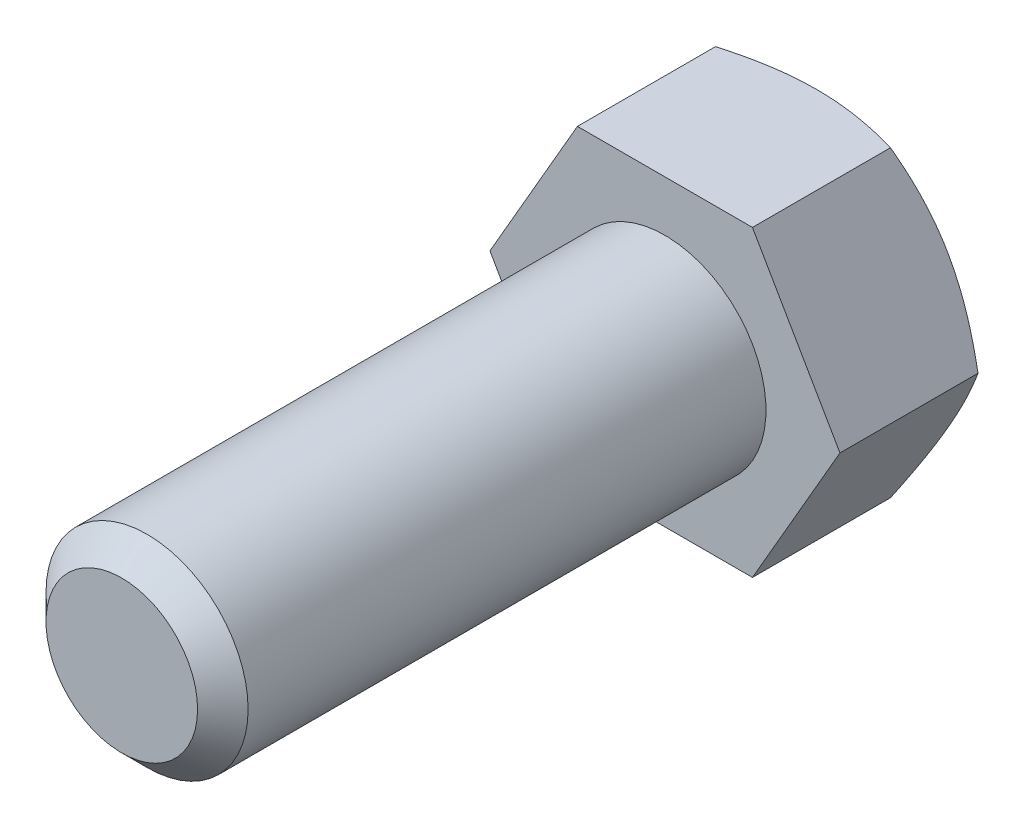
ISO-10303-21;
HEADER;
FILE_DESCRIPTION(('STEP AP214'),'2;1');
FILE_NAME('part.step','',(''),(''),'','','');
FILE_SCHEMA(('AUTOMOTIVE_DESIGN { 1 0 10303 214 1 1 1 1 }'));
ENDSEC;
DATA;
#1=APPLICATION_CONTEXT('core data for automotive mechanical design processes');
#2=APPLICATION_PROTOCOL_DEFINITION('international standard','automotive_design',2000,#1);
#3=PRODUCT_CONTEXT('',#1,'mechanical');
#4=PRODUCT('Part','Part','',(#3));
#5=PRODUCT_RELATED_PRODUCT_CATEGORY('part','',(#4));
#6=PRODUCT_DEFINITION_FORMATION('','',#4);
#7=PRODUCT_DEFINITION_CONTEXT('part definition',#1,'design');
#8=PRODUCT_DEFINITION('design','',#6,#7);
#9=PRODUCT_DEFINITION_SHAPE('','',#8);
#10=(LENGTH_UNIT() NAMED_UNIT(*) SI_UNIT(.MILLI.,.METRE.));
#11=(NAMED_UNIT(*) PLANE_ANGLE_UNIT() SI_UNIT($,.RADIAN.));
#12=(NAMED_UNIT(*) SI_UNIT($,.STERADIAN.) SOLID_ANGLE_UNIT());
#13=UNCERTAINTY_MEASURE_WITH_UNIT(LENGTH_MEASURE(1.E-05),#10,'distance_accuracy_value','');
#14=(GEOMETRIC_REPRESENTATION_CONTEXT(3) GLOBAL_UNCERTAINTY_ASSIGNED_CONTEXT((#13)) GLOBAL_UNIT_ASSIGNED_CONTEXT((#10,
#11,#12)) REPRESENTATION_CONTEXT('',''));
#15=CARTESIAN_POINT('',(0.,0.,0.));
#16=DIRECTION('',(0.,0.,1.));
#17=DIRECTION('',(1.,0.,0.));
#18=AXIS2_PLACEMENT_3D('',#15,#16,#17);
#19=CARTESIAN_POINT('',(0.,0.,21.5));
#20=DIRECTION('',(0.,0.,-1.));
#21=DIRECTION('',(-1.,0.,0.));
#22=AXIS2_PLACEMENT_3D('',#19,#20,#21);
#23=CYLINDRICAL_SURFACE('',#22,4.);
#24=CARTESIAN_POINT('',(0.,0.,20.5));
#25=DIRECTION('',(0.,0.,1.));
#26=DIRECTION('',(1.,0.,0.));
#27=AXIS2_PLACEMENT_3D('',#24,#25,#26);
#28=CIRCLE('',#27,4.);
#29=CARTESIAN_POINT('',(4.,0.,20.5));
#30=VERTEX_POINT('',#29);
#31=EDGE_CURVE('E11',#30,#30,#28,.F.);
#32=ORIENTED_EDGE('',*,*,#31,.T.);
#33=EDGE_LOOP('',(#32));
#34=FACE_BOUND('',#33,.T.);
#35=CARTESIAN_POINT('',(0.,0.,0.));
#36=DIRECTION('',(0.,0.,-1.));
#37=DIRECTION('',(-1.,0.,0.));
#38=AXIS2_PLACEMENT_3D('',#35,#36,#37);
#39=CIRCLE('',#38,4.);
#40=CARTESIAN_POINT('',(-4.,0.,0.));
#41=VERTEX_POINT('',#40);
#42=EDGE_CURVE('E143',#41,#41,#39,.T.);
#43=ORIENTED_EDGE('',*,*,#42,.F.);
#44=EDGE_LOOP('',(#43));
#45=FACE_BOUND('',#44,.T.);
#46=ADVANCED_FACE('F32',(#34,#45),#23,.T.);
#47=CARTESIAN_POINT('',(0.,0.,21.5));
#48=DIRECTION('',(0.,0.,1.));
#49=DIRECTION('',(1.,0.,0.));
#50=AXIS2_PLACEMENT_3D('',#47,#48,#49);
#51=PLANE('',#50);
#52=CARTESIAN_POINT('',(0.,0.,21.5));
#53=DIRECTION('',(0.,0.,1.));
#54=DIRECTION('',(1.,0.,0.));
#55=AXIS2_PLACEMENT_3D('',#52,#53,#54);
#56=CIRCLE('',#55,3.00000000000001);
#57=CARTESIAN_POINT('',(3.00000000000001,0.,21.5));
#58=VERTEX_POINT('',#57);
#59=EDGE_CURVE('E40',#58,#58,#56,.T.);
#60=ORIENTED_EDGE('',*,*,#59,.T.);
#61=EDGE_LOOP('',(#60));
#62=FACE_BOUND('',#61,.T.);
#63=ADVANCED_FACE('F235',(#62),#51,.T.);
#64=CARTESIAN_POINT('',(-3.46410161513776,-6.,0.));
#65=DIRECTION('',(0.,0.,-1.));
#66=DIRECTION('',(-1.,0.,0.));
#67=AXIS2_PLACEMENT_3D('',#64,#65,#66);
#68=PLANE('',#67);
#69=DIRECTION('',(-1.,0.,0.));
#70=VECTOR('',#69,1.);
#71=CARTESIAN_POINT('',(3.46410161513775,-6.,0.));
#72=LINE('',#71,#70);
#73=CARTESIAN_POINT('',(3.46410161513775,-6.,0.));
#74=VERTEX_POINT('',#73);
#75=CARTESIAN_POINT('',(-3.46410161513776,-6.,0.));
#76=VERTEX_POINT('',#75);
#77=EDGE_CURVE('E179',#74,#76,#72,.T.);
#78=ORIENTED_EDGE('',*,*,#77,.F.);
#79=DIRECTION('',(-0.5,-0.866025403784438,0.));
#80=VECTOR('',#79,1.);
#81=CARTESIAN_POINT('',(6.9282032302755,0.,0.));
#82=LINE('',#81,#80);
#83=CARTESIAN_POINT('',(6.9282032302755,0.,0.));
#84=VERTEX_POINT('',#83);
#85=EDGE_CURVE('E267',#84,#74,#82,.T.);
#86=ORIENTED_EDGE('',*,*,#85,.F.);
#87=DIRECTION('',(0.5,-0.866025403784439,0.));
#88=VECTOR('',#87,1.);
#89=CARTESIAN_POINT('',(3.46410161513775,6.,0.));
#90=LINE('',#89,#88);
#91=CARTESIAN_POINT('',(3.46410161513775,6.,0.));
#92=VERTEX_POINT('',#91);
#93=EDGE_CURVE('E265',#92,#84,#90,.T.);
#94=ORIENTED_EDGE('',*,*,#93,.F.);
#95=DIRECTION('',(1.,0.,0.));
#96=VECTOR('',#95,1.);
#97=CARTESIAN_POINT('',(-3.46410161513775,6.,0.));
#98=LINE('',#97,#96);
#99=CARTESIAN_POINT('',(-3.46410161513775,6.,0.));
#100=VERTEX_POINT('',#99);
#101=EDGE_CURVE('E129',#100,#92,#98,.T.);
#102=ORIENTED_EDGE('',*,*,#101,.F.);
#103=DIRECTION('',(0.5,0.866025403784439,0.));
#104=VECTOR('',#103,1.);
#105=CARTESIAN_POINT('',(-6.92820323027551,0.,0.));
#106=LINE('',#105,#104);
#107=CARTESIAN_POINT('',(-6.92820323027551,0.,0.));
#108=VERTEX_POINT('',#107);
#109=EDGE_CURVE('E262',#108,#100,#106,.T.);
#110=ORIENTED_EDGE('',*,*,#109,.F.);
#111=DIRECTION('',(-0.5,0.866025403784439,0.));
#112=VECTOR('',#111,1.);
#113=CARTESIAN_POINT('',(-3.46410161513776,-6.,0.));
#114=LINE('',#113,#112);
#115=EDGE_CURVE('E181',#76,#108,#114,.T.);
#116=ORIENTED_EDGE('',*,*,#115,.F.);
#117=EDGE_LOOP('',(#78,#86,#94,#102,#110,#116));
#118=FACE_BOUND('',#117,.T.);
#119=ORIENTED_EDGE('',*,*,#42,.T.);
#120=EDGE_LOOP('',(#119));
#121=FACE_BOUND('',#120,.T.);
#122=ADVANCED_FACE('F232',(#118,#121),#68,.F.);
#123=CARTESIAN_POINT('',(3.46410161513775,-6.,-6.));
#124=DIRECTION('',(0.,1.,0.));
#125=DIRECTION('',(-1.,0.,0.));
#126=AXIS2_PLACEMENT_3D('',#123,#124,#125);
#127=PLANE('',#126);
#128=DIRECTION('',(0.,0.,1.));
#129=VECTOR('',#128,1.);
#130=CARTESIAN_POINT('',(-3.46410161513776,-6.,-6.));
#131=LINE('',#130,#129);
#132=CARTESIAN_POINT('',(-3.46410161513776,-5.99999999999999,-5.46410161513775));
#133=VERTEX_POINT('',#132);
#134=EDGE_CURVE('E141',#133,#76,#131,.T.);
#135=ORIENTED_EDGE('',*,*,#134,.F.);
#136=CARTESIAN_POINT('',(-9.18730798493837,-6.,-3.12883976813902));
#137=CARTESIAN_POINT('',(-8.92387405680199,-6.,-3.25614559419349));
#138=CARTESIAN_POINT('',(-8.65981728204025,-6.,-3.38218589446083));
#139=CARTESIAN_POINT('',(-8.13012127105821,-6.,-3.63101227963227));
#140=CARTESIAN_POINT('',(-7.86448177047662,-6.,-3.75379780110516));
#141=CARTESIAN_POINT('',(-7.32984857652428,-6.,-3.9960383057581));
#142=CARTESIAN_POINT('',(-7.06084438765349,-6.,-4.11547020861922));
#143=CARTESIAN_POINT('',(-6.52062501689612,-6.,-4.34920412065581));
#144=CARTESIAN_POINT('',(-6.24940995113133,-6.,-4.46350639722907));
#145=CARTESIAN_POINT('',(-5.70097061739307,-6.,-4.6869740289727));
#146=CARTESIAN_POINT('',(-5.42371345319408,-6.,-4.79605909080157));
#147=CARTESIAN_POINT('',(-4.86592864106517,-6.,-5.00568563643364));
#148=CARTESIAN_POINT('',(-4.58540063320821,-6.,-5.10622616970276));
#149=CARTESIAN_POINT('',(-4.02120500054274,-6.,-5.2960624411625));
#150=CARTESIAN_POINT('',(-3.73754550105854,-6.,-5.38538208572986));
#151=CARTESIAN_POINT('',(-3.16619097443998,-6.,-5.54987472735296));
#152=CARTESIAN_POINT('',(-2.87849725452286,-6.,-5.62505219808297));
#153=CARTESIAN_POINT('',(-2.29889164457506,-6.,-5.75761469520685));
#154=CARTESIAN_POINT('',(-2.0069786530133,-6.,-5.81499498413221));
#155=CARTESIAN_POINT('',(-1.41959231625986,-6.,-5.90808533304653));
#156=CARTESIAN_POINT('',(-1.12411896792062,-6.,-5.94379537387626));
#157=CARTESIAN_POINT('',(-0.680438735196221,-6.,-5.97881855810124));
#158=CARTESIAN_POINT('',(-0.53292635721201,-6.,-5.98740441714177));
#159=CARTESIAN_POINT('',(-0.237663606264503,-6.,-5.99832545726344));
#160=CARTESIAN_POINT('',(-0.0899132364168048,-6.,-6.00066071951749));
#161=CARTESIAN_POINT('',(0.205509638911241,-6.,-5.99901783541769));
#162=CARTESIAN_POINT('',(0.353182154606617,-6.,-5.9950414609043));
#163=CARTESIAN_POINT('',(0.648231355348831,-6.,-5.98087607767417));
#164=CARTESIAN_POINT('',(0.795608025253494,-6.,-5.97068675870647));
#165=CARTESIAN_POINT('',(1.15280356987546,-6.,-5.93867365999944));
#166=CARTESIAN_POINT('',(1.36234795134398,-6.,-5.91373672745244));
#167=CARTESIAN_POINT('',(1.77983105181144,-6.,-5.85268625722611));
#168=CARTESIAN_POINT('',(1.98776931664951,-6.,-5.81656966890792));
#169=CARTESIAN_POINT('',(2.4018685647083,-6.,-5.73444076581617));
#170=CARTESIAN_POINT('',(2.60802767447155,-6.,-5.68841909457091));
#171=CARTESIAN_POINT('',(3.01822481374517,-6.,-5.58788421774175));
#172=CARTESIAN_POINT('',(3.22226304114188,-6.,-5.53337181210118));
#173=CARTESIAN_POINT('',(3.63324382691672,-6.,-5.41573466169866));
#174=CARTESIAN_POINT('',(3.84013498116184,-6.,-5.35243156345535));
#175=CARTESIAN_POINT('',(4.25173044522394,-6.,-5.2195706551928));
#176=CARTESIAN_POINT('',(4.45643615593418,-6.,-5.15001715929896));
#177=CARTESIAN_POINT('',(4.86283932319813,-6.,-5.00609215113832));
#178=CARTESIAN_POINT('',(5.06454722675188,-6.,-4.93174996149461));
#179=CARTESIAN_POINT('',(5.46639806025811,-6.,-4.77870211902801));
#180=CARTESIAN_POINT('',(5.66654031987448,-6.,-4.69999470264218));
#181=CARTESIAN_POINT('',(5.86595548480023,-6.,-4.61953649018731));
#182=B_SPLINE_CURVE_WITH_KNOTS('',3,(#136,#137,#138,#139,#140,#141,#142,#143,#144,#145,#146,
#147,#148,#149,#150,#151,#152,#153,#154,#155,#156,#157,#158,#159,#160,#161,#162,#163,#164,#165,
#166,#167,#168,#169,#170,#171,#172,#173,#174,#175,#176,#177,#178,#179,#180,#181),.UNSPECIFIED.,
.F.,.F.,(4,2,2,2,2,2,2,2,2,2,2,2,2,2,2,2,2,2,2,2,2,2,4),(0.,0.877757688798423,1.7556663458989,
2.63859891968983,3.52148541427241,4.4152110149623,5.30903590816034,6.20092297046388,
7.09252742087207,7.98436900601768,8.8762113796622,9.31938497202548,9.76255280911933,
10.2055962594862,10.6486618355806,11.2813783152956,11.9142675993976,12.5477573636587,
13.1811874805773,13.8301443386227,14.4786566669059,15.1235187321248,15.7686432484322),.UNSPECIFIED.);
#183=CARTESIAN_POINT('',(0.,-6.,-6.));
#184=VERTEX_POINT('',#183);
#185=EDGE_CURVE('E125',#133,#184,#182,.T.);
#186=ORIENTED_EDGE('',*,*,#185,.T.);
#187=CARTESIAN_POINT('',(3.46410161513775,-6.,-5.46410161513775));
#188=VERTEX_POINT('',#187);
#189=EDGE_CURVE('E47',#184,#188,#182,.T.);
#190=ORIENTED_EDGE('',*,*,#189,.T.);
#191=DIRECTION('',(0.,0.,1.));
#192=VECTOR('',#191,1.);
#193=CARTESIAN_POINT('',(3.46410161513775,-6.,-6.));
#194=LINE('',#193,#192);
#195=EDGE_CURVE('E136',#188,#74,#194,.T.);
#196=ORIENTED_EDGE('',*,*,#195,.T.);
#197=ORIENTED_EDGE('',*,*,#77,.T.);
#198=EDGE_LOOP('',(#135,#186,#190,#196,#197));
#199=FACE_BOUND('',#198,.T.);
#200=ADVANCED_FACE('F234',(#199),#127,.F.);
#201=CARTESIAN_POINT('',(-3.46410161513776,-6.,-6.));
#202=DIRECTION('',(0.866025403784439,0.5,0.));
#203=DIRECTION('',(-0.5,0.866025403784439,0.));
#204=AXIS2_PLACEMENT_3D('',#201,#202,#203);
#205=PLANE('',#204);
#206=DIRECTION('',(0.,0.,1.));
#207=VECTOR('',#206,1.);
#208=CARTESIAN_POINT('',(-6.92820323027551,0.,-6.));
#209=LINE('',#208,#207);
#210=CARTESIAN_POINT('',(-6.9282032302755,0.,-5.46410161513775));
#211=VERTEX_POINT('',#210);
#212=EDGE_CURVE('E134',#211,#108,#209,.T.);
#213=ORIENTED_EDGE('',*,*,#212,.F.);
#214=CARTESIAN_POINT('',(-6.92831870032935,0.000199999999999566,-5.46403494680444));
#215=CARTESIAN_POINT('',(-6.85217369681759,-0.131687014824876,-5.50799100088407));
#216=CARTESIAN_POINT('',(-6.7757447877387,-0.264065768516575,-5.5499521927796));
#217=CARTESIAN_POINT('',(-6.62226628317934,-0.529898336283082,-5.62933542320521));
#218=CARTESIAN_POINT('',(-6.54521643511296,-0.663352587849513,-5.66675550360435));
#219=CARTESIAN_POINT('',(-6.31283321525997,-1.06585213146133,-5.77146958991382));
#220=CARTESIAN_POINT('',(-6.15658254390818,-1.33648623295938,-5.83102994261809));
#221=CARTESIAN_POINT('',(-5.92275625451824,-1.74148524632807,-5.90087178928477));
#222=CARTESIAN_POINT('',(-5.84587929350304,-1.87464004873788,-5.92076777194817));
#223=CARTESIAN_POINT('',(-5.69177799808121,-2.14155132192067,-5.95413058520104));
#224=CARTESIAN_POINT('',(-5.6145536949758,-2.27530773847835,-5.96759798384113));
#225=CARTESIAN_POINT('',(-5.45997096038123,-2.54305288876908,-5.98776040824964));
#226=CARTESIAN_POINT('',(-5.38261278137646,-2.67704118518633,-5.99446312000014));
#227=CARTESIAN_POINT('',(-5.22782922676437,-2.94513416595059,-6.00095963658988));
#228=CARTESIAN_POINT('',(-5.1504038533067,-3.07923884657428,-6.00075365485193));
#229=CARTESIAN_POINT('',(-4.93828180440546,-3.44664501267684,-5.99069281477429));
#230=CARTESIAN_POINT('',(-4.8036545605159,-3.67982623917651,-5.97380210699772));
#231=CARTESIAN_POINT('',(-4.53529425885134,-4.14463991639405,-5.92024077720943));
#232=CARTESIAN_POINT('',(-4.40156214490546,-4.3762707323519,-5.88355184703624));
#233=CARTESIAN_POINT('',(-4.13266173796312,-4.84201989935198,-5.7918398733043));
#234=CARTESIAN_POINT('',(-3.99752737632065,-5.07607947956512,-5.73642824328934));
#235=CARTESIAN_POINT('',(-3.7292739250165,-5.54070808652961,-5.61066608681661));
#236=CARTESIAN_POINT('',(-3.59615139973116,-5.77128306395569,-5.54034510268382));
#237=CARTESIAN_POINT('',(-3.46398614508392,-6.0002,-5.46403494680444));
#238=B_SPLINE_CURVE_WITH_KNOTS('',3,(#214,#215,#216,#217,#218,#219,#220,#221,#222,#223,#224,
#225,#226,#227,#228,#229,#230,#231,#232,#233,#234,#235,#236,#237),.UNSPECIFIED.,.F.,.F.,(4,2,2,
2,2,2,2,2,2,2,2,4),(0.,0.475482194578527,0.95116869439248,1.90451835622162,2.36951738073403,
2.83447530880777,3.29890435872168,3.76331906154279,4.57182194271095,5.38107376137308,
6.20827406017204,7.03385036012984),.UNSPECIFIED.);
#239=CARTESIAN_POINT('',(-5.19615242270663,-3.,-6.));
#240=VERTEX_POINT('',#239);
#241=EDGE_CURVE('E171',#211,#240,#238,.T.);
#242=ORIENTED_EDGE('',*,*,#241,.T.);
#243=EDGE_CURVE('E114',#240,#133,#238,.T.);
#244=ORIENTED_EDGE('',*,*,#243,.T.);
#245=ORIENTED_EDGE('',*,*,#134,.T.);
#246=ORIENTED_EDGE('',*,*,#115,.T.);
#247=EDGE_LOOP('',(#213,#242,#244,#245,#246));
#248=FACE_BOUND('',#247,.T.);
#249=ADVANCED_FACE('F241',(#248),#205,.F.);
#250=CARTESIAN_POINT('',(-6.92820323027551,0.,-6.));
#251=DIRECTION('',(0.866025403784438,-0.5,0.));
#252=DIRECTION('',(0.5,0.866025403784439,0.));
#253=AXIS2_PLACEMENT_3D('',#250,#251,#252);
#254=PLANE('',#253);
#255=DIRECTION('',(0.,0.,1.));
#256=VECTOR('',#255,1.);
#257=CARTESIAN_POINT('',(-3.46410161513775,6.,-6.));
#258=LINE('',#257,#256);
#259=CARTESIAN_POINT('',(-3.46410161513775,6.,-5.46410161513775));
#260=VERTEX_POINT('',#259);
#261=EDGE_CURVE('E131',#260,#100,#258,.T.);
#262=ORIENTED_EDGE('',*,*,#261,.F.);
#263=CARTESIAN_POINT('',(-3.46398614508392,6.0002,-5.46403494680445));
#264=CARTESIAN_POINT('',(-3.54013114859567,5.86831298517512,-5.50799100088407));
#265=CARTESIAN_POINT('',(-3.61656005767456,5.73593423148342,-5.5499521927796));
#266=CARTESIAN_POINT('',(-3.77003856223393,5.47010166371692,-5.62933542320521));
#267=CARTESIAN_POINT('',(-3.8470884103003,5.33664741215048,-5.66675550360435));
#268=CARTESIAN_POINT('',(-4.07947163015329,4.93414786853867,-5.77146958991382));
#269=CARTESIAN_POINT('',(-4.23572230150508,4.66351376704062,-5.8310299426181));
#270=CARTESIAN_POINT('',(-4.46954859089502,4.25851475367193,-5.90087178928477));
#271=CARTESIAN_POINT('',(-4.54642555191022,4.12535995126212,-5.92076777194817));
#272=CARTESIAN_POINT('',(-4.70052684733205,3.85844867807933,-5.95413058520104));
#273=CARTESIAN_POINT('',(-4.77775115043746,3.72469226152165,-5.96759798384113));
#274=CARTESIAN_POINT('',(-4.93233388503204,3.45694711123092,-5.98776040824964));
#275=CARTESIAN_POINT('',(-5.0096920640368,3.32295881481367,-5.99446312000014));
#276=CARTESIAN_POINT('',(-5.16447561864889,3.05486583404941,-6.00095963658988));
#277=CARTESIAN_POINT('',(-5.24190099210656,2.92076115342572,-6.00075365485193));
#278=CARTESIAN_POINT('',(-5.45402304100781,2.55335498732316,-5.99069281477429));
#279=CARTESIAN_POINT('',(-5.58865028489736,2.32017376082349,-5.97380210699772));
#280=CARTESIAN_POINT('',(-5.85701058656193,1.85536008360595,-5.92024077720943));
#281=CARTESIAN_POINT('',(-5.99074270050781,1.62372926764809,-5.88355184703624));
#282=CARTESIAN_POINT('',(-6.25964310745014,1.15798010064802,-5.7918398733043));
#283=CARTESIAN_POINT('',(-6.39477746909261,0.923920520434875,-5.73642824328934));
#284=CARTESIAN_POINT('',(-6.66303092039676,0.459291913470389,-5.61066608681661));
#285=CARTESIAN_POINT('',(-6.7961534456821,0.228716936044308,-5.54034510268382));
#286=CARTESIAN_POINT('',(-6.92831870032935,-0.000200000000000896,-5.46403494680444));
#287=B_SPLINE_CURVE_WITH_KNOTS('',3,(#263,#264,#265,#266,#267,#268,#269,#270,#271,#272,#273,
#274,#275,#276,#277,#278,#279,#280,#281,#282,#283,#284,#285,#286),.UNSPECIFIED.,.F.,.F.,(4,2,2,
2,2,2,2,2,2,2,2,4),(0.,0.475482194578527,0.951168694392479,1.90451835622162,2.36951738073403,
2.83447530880777,3.29890435872168,3.76331906154279,4.57182194271094,5.38107376137308,
6.20827406017204,7.03385036012984),.UNSPECIFIED.);
#288=CARTESIAN_POINT('',(-5.19615242270663,3.,-6.));
#289=VERTEX_POINT('',#288);
#290=EDGE_CURVE('E163',#260,#289,#287,.T.);
#291=ORIENTED_EDGE('',*,*,#290,.T.);
#292=EDGE_CURVE('E168',#289,#211,#287,.T.);
#293=ORIENTED_EDGE('',*,*,#292,.T.);
#294=ORIENTED_EDGE('',*,*,#212,.T.);
#295=ORIENTED_EDGE('',*,*,#109,.T.);
#296=EDGE_LOOP('',(#262,#291,#293,#294,#295));
#297=FACE_BOUND('',#296,.T.);
#298=ADVANCED_FACE('F177',(#297),#254,.F.);
#299=CARTESIAN_POINT('',(-3.46410161513775,6.,-6.));
#300=DIRECTION('',(0.,-1.,0.));
#301=DIRECTION('',(0.,0.,-1.));
#302=AXIS2_PLACEMENT_3D('',#299,#300,#301);
#303=PLANE('',#302);
#304=DIRECTION('',(0.,0.,1.));
#305=VECTOR('',#304,1.);
#306=CARTESIAN_POINT('',(3.46410161513775,6.,-6.));
#307=LINE('',#306,#305);
#308=CARTESIAN_POINT('',(3.46410161513775,6.,-5.46410161513775));
#309=VERTEX_POINT('',#308);
#310=EDGE_CURVE('E122',#309,#92,#307,.T.);
#311=ORIENTED_EDGE('',*,*,#310,.F.);
#312=CARTESIAN_POINT('',(-9.18730798493837,6.,-3.12883976813902));
#313=CARTESIAN_POINT('',(-8.92387405680198,6.,-3.2561455941935));
#314=CARTESIAN_POINT('',(-8.65981728204025,6.,-3.38218589446084));
#315=CARTESIAN_POINT('',(-8.13012127105821,6.,-3.63101227963227));
#316=CARTESIAN_POINT('',(-7.86448177047662,6.,-3.75379780110517));
#317=CARTESIAN_POINT('',(-7.32984857652428,6.,-3.9960383057581));
#318=CARTESIAN_POINT('',(-7.06084438765349,6.,-4.11547020861922));
#319=CARTESIAN_POINT('',(-6.52062501689612,6.,-4.34920412065581));
#320=CARTESIAN_POINT('',(-6.24940995113133,6.,-4.46350639722907));
#321=CARTESIAN_POINT('',(-5.70097061739307,6.,-4.6869740289727));
#322=CARTESIAN_POINT('',(-5.42371345319408,6.,-4.79605909080157));
#323=CARTESIAN_POINT('',(-4.86592864106517,6.,-5.00568563643364));
#324=CARTESIAN_POINT('',(-4.58540063320821,6.,-5.10622616970276));
#325=CARTESIAN_POINT('',(-4.02120500054274,6.,-5.2960624411625));
#326=CARTESIAN_POINT('',(-3.73754550105854,6.,-5.38538208572986));
#327=CARTESIAN_POINT('',(-3.16619097443998,6.,-5.54987472735296));
#328=CARTESIAN_POINT('',(-2.87849725452286,6.,-5.62505219808297));
#329=CARTESIAN_POINT('',(-2.29889164457506,6.,-5.75761469520685));
#330=CARTESIAN_POINT('',(-2.0069786530133,6.,-5.81499498413222));
#331=CARTESIAN_POINT('',(-1.41959231625986,6.,-5.90808533304653));
#332=CARTESIAN_POINT('',(-1.12411896792062,6.,-5.94379537387627));
#333=CARTESIAN_POINT('',(-0.680438735196222,6.,-5.97881855810124));
#334=CARTESIAN_POINT('',(-0.532926357212011,6.,-5.98740441714178));
#335=CARTESIAN_POINT('',(-0.237663606264504,6.,-5.99832545726344));
#336=CARTESIAN_POINT('',(-0.0899132364168056,6.,-6.00066071951749));
#337=CARTESIAN_POINT('',(0.205509638911241,6.,-5.99901783541769));
#338=CARTESIAN_POINT('',(0.353182154606617,6.,-5.9950414609043));
#339=CARTESIAN_POINT('',(0.648231355348831,6.,-5.98087607767417));
#340=CARTESIAN_POINT('',(0.795608025253494,6.,-5.97068675870647));
#341=CARTESIAN_POINT('',(1.15280356987546,6.,-5.93867365999944));
#342=CARTESIAN_POINT('',(1.36234795134398,6.,-5.91373672745244));
#343=CARTESIAN_POINT('',(1.77983105181144,6.,-5.85268625722611));
#344=CARTESIAN_POINT('',(1.98776931664951,6.,-5.81656966890792));
#345=CARTESIAN_POINT('',(2.40186856470829,6.,-5.73444076581617));
#346=CARTESIAN_POINT('',(2.60802767447155,6.,-5.68841909457092));
#347=CARTESIAN_POINT('',(3.01822481374517,6.,-5.58788421774175));
#348=CARTESIAN_POINT('',(3.22226304114187,6.,-5.53337181210119));
#349=CARTESIAN_POINT('',(3.63324382691672,6.,-5.41573466169866));
#350=CARTESIAN_POINT('',(3.84013498116184,6.,-5.35243156345535));
#351=CARTESIAN_POINT('',(4.25173044522394,6.,-5.2195706551928));
#352=CARTESIAN_POINT('',(4.45643615593417,6.,-5.15001715929896));
#353=CARTESIAN_POINT('',(4.86283932319813,6.,-5.00609215113832));
#354=CARTESIAN_POINT('',(5.06454722675187,6.,-4.93174996149461));
#355=CARTESIAN_POINT('',(5.46639806025811,6.,-4.77870211902801));
#356=CARTESIAN_POINT('',(5.66654031987448,6.,-4.69999470264218));
#357=CARTESIAN_POINT('',(5.86595548480022,6.,-4.61953649018731));
#358=B_SPLINE_CURVE_WITH_KNOTS('',3,(#312,#313,#314,#315,#316,#317,#318,#319,#320,#321,#322,
#323,#324,#325,#326,#327,#328,#329,#330,#331,#332,#333,#334,#335,#336,#337,#338,#339,#340,#341,
#342,#343,#344,#345,#346,#347,#348,#349,#350,#351,#352,#353,#354,#355,#356,#357),.UNSPECIFIED.,
.F.,.F.,(4,2,2,2,2,2,2,2,2,2,2,2,2,2,2,2,2,2,2,2,2,2,4),(0.,0.877757688798423,1.7556663458989,
2.63859891968983,3.5214854142724,4.41521101496229,5.30903590816033,6.20092297046387,
7.09252742087206,7.98436900601767,8.87621137966219,9.31938497202548,9.76255280911933,
10.2055962594862,10.6486618355806,11.2813783152956,11.9142675993976,12.5477573636587,
13.1811874805773,13.8301443386227,14.4786566669059,15.1235187321248,15.7686432484322),.UNSPECIFIED.);
#359=CARTESIAN_POINT('',(0.,6.,-6.));
#360=VERTEX_POINT('',#359);
#361=EDGE_CURVE('E104',#309,#360,#358,.F.);
#362=ORIENTED_EDGE('',*,*,#361,.T.);
#363=EDGE_CURVE('E116',#360,#260,#358,.F.);
#364=ORIENTED_EDGE('',*,*,#363,.T.);
#365=ORIENTED_EDGE('',*,*,#261,.T.);
#366=ORIENTED_EDGE('',*,*,#101,.T.);
#367=EDGE_LOOP('',(#311,#362,#364,#365,#366));
#368=FACE_BOUND('',#367,.T.);
#369=ADVANCED_FACE('F127',(#368),#303,.F.);
#370=CARTESIAN_POINT('',(3.46410161513775,6.,-6.));
#371=DIRECTION('',(-0.866025403784439,-0.5,0.));
#372=DIRECTION('',(0.5,-0.866025403784439,0.));
#373=AXIS2_PLACEMENT_3D('',#370,#371,#372);
#374=PLANE('',#373);
#375=DIRECTION('',(0.,0.,1.));
#376=VECTOR('',#375,1.);
#377=CARTESIAN_POINT('',(6.9282032302755,0.,-6.));
#378=LINE('',#377,#376);
#379=CARTESIAN_POINT('',(6.9282032302755,0.,-5.46410161513775));
#380=VERTEX_POINT('',#379);
#381=EDGE_CURVE('E132',#380,#84,#378,.T.);
#382=ORIENTED_EDGE('',*,*,#381,.F.);
#383=CARTESIAN_POINT('',(6.92831870032934,-0.000200000000000209,-5.46403494680445));
#384=CARTESIAN_POINT('',(6.85217369681758,0.131687014824876,-5.50799100088407));
#385=CARTESIAN_POINT('',(6.7757447877387,0.264065768516574,-5.5499521927796));
#386=CARTESIAN_POINT('',(6.62226628317933,0.52989833628308,-5.62933542320521));
#387=CARTESIAN_POINT('',(6.54521643511295,0.663352587849511,-5.66675550360435));
#388=CARTESIAN_POINT('',(6.31283321525997,1.06585213146133,-5.77146958991382));
#389=CARTESIAN_POINT('',(6.15658254390818,1.33648623295938,-5.8310299426181));
#390=CARTESIAN_POINT('',(5.92275625451823,1.74148524632806,-5.90087178928477));
#391=CARTESIAN_POINT('',(5.84587929350304,1.87464004873788,-5.92076777194818));
#392=CARTESIAN_POINT('',(5.69177799808121,2.14155132192067,-5.95413058520104));
#393=CARTESIAN_POINT('',(5.61455369497579,2.27530773847834,-5.96759798384113));
#394=CARTESIAN_POINT('',(5.45997096038122,2.54305288876908,-5.98776040824964));
#395=CARTESIAN_POINT('',(5.38261278137646,2.67704118518633,-5.99446312000015));
#396=CARTESIAN_POINT('',(5.22782922676437,2.94513416595059,-6.00095963658988));
#397=CARTESIAN_POINT('',(5.15040385330669,3.07923884657427,-6.00075365485193));
#398=CARTESIAN_POINT('',(4.93828180440545,3.44664501267683,-5.99069281477429));
#399=CARTESIAN_POINT('',(4.8036545605159,3.6798262391765,-5.97380210699773));
#400=CARTESIAN_POINT('',(4.53529425885133,4.14463991639404,-5.92024077720943));
#401=CARTESIAN_POINT('',(4.40156214490545,4.3762707323519,-5.88355184703624));
#402=CARTESIAN_POINT('',(4.13266173796312,4.84201989935198,-5.7918398733043));
#403=CARTESIAN_POINT('',(3.99752737632065,5.07607947956512,-5.73642824328934));
#404=CARTESIAN_POINT('',(3.7292739250165,5.54070808652961,-5.61066608681661));
#405=CARTESIAN_POINT('',(3.59615139973116,5.77128306395569,-5.54034510268382));
#406=CARTESIAN_POINT('',(3.46398614508391,6.0002,-5.46403494680445));
#407=B_SPLINE_CURVE_WITH_KNOTS('',3,(#383,#384,#385,#386,#387,#388,#389,#390,#391,#392,#393,
#394,#395,#396,#397,#398,#399,#400,#401,#402,#403,#404,#405,#406),.UNSPECIFIED.,.F.,.F.,(4,2,2,
2,2,2,2,2,2,2,2,4),(0.,0.475482194578526,0.951168694392479,1.90451835622162,2.36951738073403,
2.83447530880776,3.29890435872168,3.76331906154279,4.57182194271094,5.38107376137308,
6.20827406017204,7.03385036012984),.UNSPECIFIED.);
#408=CARTESIAN_POINT('',(5.19615242270663,3.,-6.));
#409=VERTEX_POINT('',#408);
#410=EDGE_CURVE('E124',#380,#409,#407,.T.);
#411=ORIENTED_EDGE('',*,*,#410,.T.);
#412=EDGE_CURVE('E107',#409,#309,#407,.T.);
#413=ORIENTED_EDGE('',*,*,#412,.T.);
#414=ORIENTED_EDGE('',*,*,#310,.T.);
#415=ORIENTED_EDGE('',*,*,#93,.T.);
#416=EDGE_LOOP('',(#382,#411,#413,#414,#415));
#417=FACE_BOUND('',#416,.T.);
#418=ADVANCED_FACE('F120',(#417),#374,.F.);
#419=CARTESIAN_POINT('',(6.9282032302755,0.,-6.));
#420=DIRECTION('',(-0.866025403784439,0.5,0.));
#421=DIRECTION('',(-0.5,-0.866025403784439,0.));
#422=AXIS2_PLACEMENT_3D('',#419,#420,#421);
#423=PLANE('',#422);
#424=ORIENTED_EDGE('',*,*,#195,.F.);
#425=CARTESIAN_POINT('',(3.46398614508391,-6.0002,-5.46403494680445));
#426=CARTESIAN_POINT('',(3.54013114859567,-5.86831298517513,-5.50799100088407));
#427=CARTESIAN_POINT('',(3.61656005767456,-5.73593423148343,-5.5499521927796));
#428=CARTESIAN_POINT('',(3.77003856223392,-5.47010166371692,-5.62933542320521));
#429=CARTESIAN_POINT('',(3.8470884103003,-5.33664741215049,-5.66675550360435));
#430=CARTESIAN_POINT('',(4.07947163015328,-4.93414786853867,-5.77146958991382));
#431=CARTESIAN_POINT('',(4.23572230150507,-4.66351376704062,-5.8310299426181));
#432=CARTESIAN_POINT('',(4.46954859089502,-4.25851475367194,-5.90087178928477));
#433=CARTESIAN_POINT('',(4.54642555191022,-4.12535995126212,-5.92076777194818));
#434=CARTESIAN_POINT('',(4.70052684733204,-3.85844867807934,-5.95413058520104));
#435=CARTESIAN_POINT('',(4.77775115043746,-3.72469226152166,-5.96759798384113));
#436=CARTESIAN_POINT('',(4.93233388503203,-3.45694711123093,-5.98776040824964));
#437=CARTESIAN_POINT('',(5.00969206403679,-3.32295881481367,-5.99446312000015));
#438=CARTESIAN_POINT('',(5.16447561864888,-3.05486583404941,-6.00095963658988));
#439=CARTESIAN_POINT('',(5.24190099210656,-2.92076115342573,-6.00075365485193));
#440=CARTESIAN_POINT('',(5.4540230410078,-2.55335498732317,-5.99069281477429));
#441=CARTESIAN_POINT('',(5.58865028489735,-2.3201737608235,-5.97380210699773));
#442=CARTESIAN_POINT('',(5.85701058656192,-1.85536008360596,-5.92024077720943));
#443=CARTESIAN_POINT('',(5.9907427005078,-1.6237292676481,-5.88355184703624));
#444=CARTESIAN_POINT('',(6.25964310745014,-1.15798010064802,-5.7918398733043));
#445=CARTESIAN_POINT('',(6.39477746909261,-0.923920520434877,-5.73642824328934));
#446=CARTESIAN_POINT('',(6.66303092039676,-0.45929191347039,-5.61066608681662));
#447=CARTESIAN_POINT('',(6.7961534456821,-0.22871693604431,-5.54034510268383));
#448=CARTESIAN_POINT('',(6.92831870032934,0.000199999999999721,-5.46403494680445));
#449=B_SPLINE_CURVE_WITH_KNOTS('',3,(#425,#426,#427,#428,#429,#430,#431,#432,#433,#434,#435,
#436,#437,#438,#439,#440,#441,#442,#443,#444,#445,#446,#447,#448),.UNSPECIFIED.,.F.,.F.,(4,2,2,
2,2,2,2,2,2,2,2,4),(0.,0.475482194578526,0.951168694392477,1.90451835622162,2.36951738073402,
2.83447530880777,3.29890435872168,3.76331906154279,4.57182194271094,5.38107376137308,
6.20827406017205,7.03385036012984),.UNSPECIFIED.);
#450=CARTESIAN_POINT('',(5.19615242270663,-3.,-6.));
#451=VERTEX_POINT('',#450);
#452=EDGE_CURVE('E275',#188,#451,#449,.T.);
#453=ORIENTED_EDGE('',*,*,#452,.T.);
#454=EDGE_CURVE('E55',#451,#380,#449,.T.);
#455=ORIENTED_EDGE('',*,*,#454,.T.);
#456=ORIENTED_EDGE('',*,*,#381,.T.);
#457=ORIENTED_EDGE('',*,*,#85,.T.);
#458=EDGE_LOOP('',(#424,#453,#455,#456,#457));
#459=FACE_BOUND('',#458,.T.);
#460=ADVANCED_FACE('F228',(#459),#423,.F.);
#461=CARTESIAN_POINT('',(0.,0.,-6.));
#462=DIRECTION('',(0.,0.,1.));
#463=DIRECTION('',(1.,0.,0.));
#464=AXIS2_PLACEMENT_3D('',#461,#462,#463);
#465=CONICAL_SURFACE('',#464,6.,1.04719755119659);
#466=CARTESIAN_POINT('',(0.,0.,-6.));
#467=DIRECTION('',(0.,0.,-1.));
#468=DIRECTION('',(-1.,0.,0.));
#469=AXIS2_PLACEMENT_3D('',#466,#467,#468);
#470=CIRCLE('',#469,6.);
#471=EDGE_CURVE('E146',#289,#240,#470,.F.);
#472=ORIENTED_EDGE('',*,*,#471,.T.);
#473=ORIENTED_EDGE('',*,*,#241,.F.);
#474=ORIENTED_EDGE('',*,*,#292,.F.);
#475=EDGE_LOOP('',(#472,#473,#474));
#476=FACE_BOUND('',#475,.T.);
#477=ADVANCED_FACE('F169',(#476),#465,.T.);
#478=ORIENTED_EDGE('',*,*,#363,.F.);
#479=EDGE_CURVE('E148',#360,#289,#470,.F.);
#480=ORIENTED_EDGE('',*,*,#479,.T.);
#481=ORIENTED_EDGE('',*,*,#290,.F.);
#482=EDGE_LOOP('',(#478,#480,#481));
#483=FACE_BOUND('',#482,.T.);
#484=ADVANCED_FACE('F161',(#483),#465,.T.);
#485=ORIENTED_EDGE('',*,*,#412,.F.);
#486=CARTESIAN_POINT('',(0.,0.,-6.));
#487=DIRECTION('',(0.,0.,1.));
#488=DIRECTION('',(1.,0.,0.));
#489=AXIS2_PLACEMENT_3D('',#486,#487,#488);
#490=CIRCLE('',#489,6.);
#491=EDGE_CURVE('E109',#409,#360,#490,.T.);
#492=ORIENTED_EDGE('',*,*,#491,.T.);
#493=ORIENTED_EDGE('',*,*,#361,.F.);
#494=EDGE_LOOP('',(#485,#492,#493));
#495=FACE_BOUND('',#494,.T.);
#496=ADVANCED_FACE('F106',(#495),#465,.T.);
#497=ORIENTED_EDGE('',*,*,#454,.F.);
#498=EDGE_CURVE('E157',#451,#409,#470,.F.);
#499=ORIENTED_EDGE('',*,*,#498,.T.);
#500=ORIENTED_EDGE('',*,*,#410,.F.);
#501=EDGE_LOOP('',(#497,#499,#500));
#502=FACE_BOUND('',#501,.T.);
#503=ADVANCED_FACE('F199',(#502),#465,.T.);
#504=EDGE_CURVE('E153',#184,#451,#470,.F.);
#505=ORIENTED_EDGE('',*,*,#504,.T.);
#506=ORIENTED_EDGE('',*,*,#452,.F.);
#507=ORIENTED_EDGE('',*,*,#189,.F.);
#508=EDGE_LOOP('',(#505,#506,#507));
#509=FACE_BOUND('',#508,.T.);
#510=ADVANCED_FACE('F278',(#509),#465,.T.);
#511=EDGE_CURVE('E149',#240,#184,#470,.F.);
#512=ORIENTED_EDGE('',*,*,#511,.T.);
#513=ORIENTED_EDGE('',*,*,#185,.F.);
#514=ORIENTED_EDGE('',*,*,#243,.F.);
#515=EDGE_LOOP('',(#512,#513,#514));
#516=FACE_BOUND('',#515,.T.);
#517=ADVANCED_FACE('F276',(#516),#465,.T.);
#518=CARTESIAN_POINT('',(-3.46410161513776,-6.,-6.));
#519=DIRECTION('',(0.,0.,-1.));
#520=DIRECTION('',(-1.,0.,0.));
#521=AXIS2_PLACEMENT_3D('',#518,#519,#520);
#522=PLANE('',#521);
#523=ORIENTED_EDGE('',*,*,#511,.F.);
#524=ORIENTED_EDGE('',*,*,#471,.F.);
#525=ORIENTED_EDGE('',*,*,#479,.F.);
#526=ORIENTED_EDGE('',*,*,#491,.F.);
#527=ORIENTED_EDGE('',*,*,#498,.F.);
#528=ORIENTED_EDGE('',*,*,#504,.F.);
#529=EDGE_LOOP('',(#523,#524,#525,#526,#527,#528));
#530=FACE_BOUND('',#529,.T.);
#531=ADVANCED_FACE('F175',(#530),#522,.T.);
#532=CARTESIAN_POINT('',(0.,0.,21.5));
#533=DIRECTION('',(0.,0.,-1.));
#534=DIRECTION('',(-1.,0.,0.));
#535=AXIS2_PLACEMENT_3D('',#532,#533,#534);
#536=CONICAL_SURFACE('',#535,3.00000000000001,0.785398163397447);
#537=ORIENTED_EDGE('',*,*,#31,.F.);
#538=EDGE_LOOP('',(#537));
#539=FACE_BOUND('',#538,.T.);
#540=ORIENTED_EDGE('',*,*,#59,.F.);
#541=EDGE_LOOP('',(#540));
#542=FACE_BOUND('',#541,.T.);
#543=ADVANCED_FACE('F34',(#539,#542),#536,.T.);
#544=CLOSED_SHELL('',(#46,#63,#122,#200,#249,#298,#369,#418,#460,#477,#484,#496,#503,#510,#517,
#531,#543));
#545=MANIFOLD_SOLID_BREP('B2',#544);
#546=ADVANCED_BREP_SHAPE_REPRESENTATION('',(#18,#545),#14);
#547=SHAPE_DEFINITION_REPRESENTATION(#9,#546);
ENDSEC;
END-ISO-10303-21;
